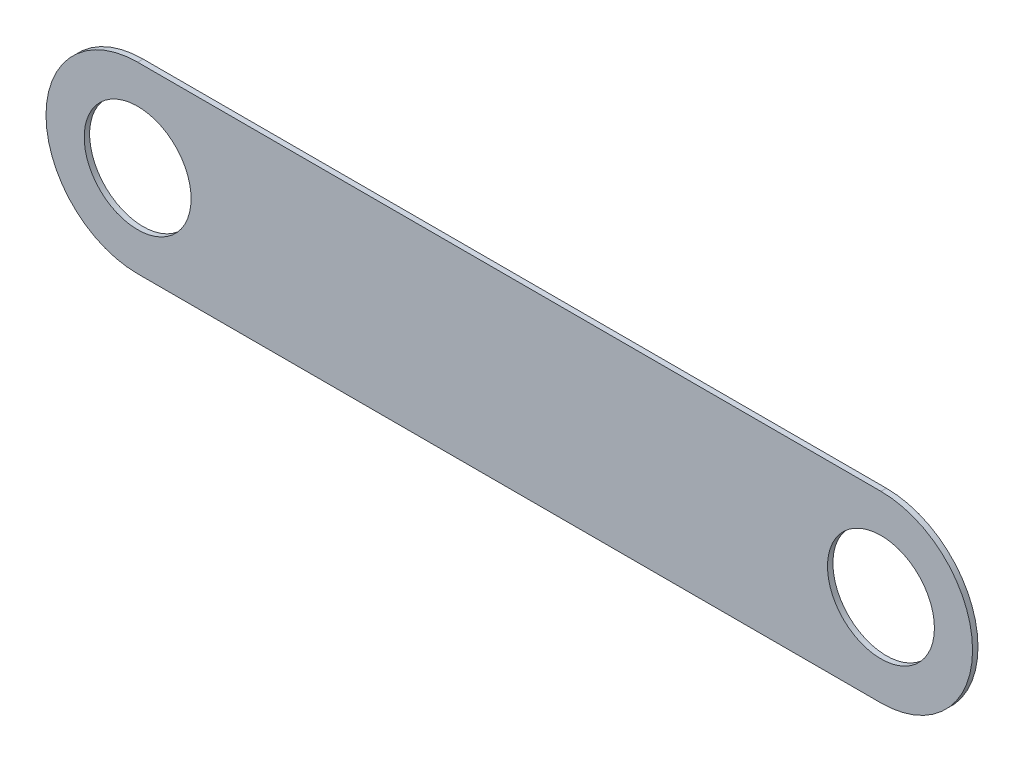
ISO-10303-21;
HEADER;
FILE_DESCRIPTION(('STEP AP214'),'2;1');
FILE_NAME('part.step','',(''),(''),'','','');
FILE_SCHEMA(('AUTOMOTIVE_DESIGN { 1 0 10303 214 1 1 1 1 }'));
ENDSEC;
DATA;
#1=APPLICATION_CONTEXT('core data for automotive mechanical design processes');
#2=APPLICATION_PROTOCOL_DEFINITION('international standard','automotive_design',2000,#1);
#3=PRODUCT_CONTEXT('',#1,'mechanical');
#4=PRODUCT('Part','Part','',(#3));
#5=PRODUCT_RELATED_PRODUCT_CATEGORY('part','',(#4));
#6=PRODUCT_DEFINITION_FORMATION('','',#4);
#7=PRODUCT_DEFINITION_CONTEXT('part definition',#1,'design');
#8=PRODUCT_DEFINITION('design','',#6,#7);
#9=PRODUCT_DEFINITION_SHAPE('','',#8);
#10=(LENGTH_UNIT() NAMED_UNIT(*) SI_UNIT(.MILLI.,.METRE.));
#11=(NAMED_UNIT(*) PLANE_ANGLE_UNIT() SI_UNIT($,.RADIAN.));
#12=(NAMED_UNIT(*) SI_UNIT($,.STERADIAN.) SOLID_ANGLE_UNIT());
#13=UNCERTAINTY_MEASURE_WITH_UNIT(LENGTH_MEASURE(1.E-05),#10,'distance_accuracy_value','');
#14=(GEOMETRIC_REPRESENTATION_CONTEXT(3) GLOBAL_UNCERTAINTY_ASSIGNED_CONTEXT((#13)) GLOBAL_UNIT_ASSIGNED_CONTEXT((#10,
#11,#12)) REPRESENTATION_CONTEXT('',''));
#15=CARTESIAN_POINT('',(0.,0.,0.));
#16=DIRECTION('',(0.,0.,1.));
#17=DIRECTION('',(1.,0.,0.));
#18=AXIS2_PLACEMENT_3D('',#15,#16,#17);
#19=CARTESIAN_POINT('',(110.466632,94.70009,0.));
#20=DIRECTION('',(0.,1.,0.));
#21=DIRECTION('',(1.,0.,0.));
#22=AXIS2_PLACEMENT_3D('',#19,#20,#21);
#23=PLANE('',#22);
#24=DIRECTION('',(1.,0.,0.));
#25=VECTOR('',#24,1.);
#26=CARTESIAN_POINT('',(110.466632,94.70009,0.03556));
#27=LINE('',#26,#25);
#28=CARTESIAN_POINT('',(110.466632,94.70009,0.03556));
#29=VERTEX_POINT('',#28);
#30=CARTESIAN_POINT('',(115.333272,94.70009,0.03556));
#31=VERTEX_POINT('',#30);
#32=EDGE_CURVE('E11',#29,#31,#27,.T.);
#33=ORIENTED_EDGE('',*,*,#32,.F.);
#34=DIRECTION('',(0.,0.,1.));
#35=VECTOR('',#34,1.);
#36=CARTESIAN_POINT('',(110.466632,94.70009,0.));
#37=LINE('',#36,#35);
#38=CARTESIAN_POINT('',(110.466632,94.70009,0.));
#39=VERTEX_POINT('',#38);
#40=EDGE_CURVE('E24',#39,#29,#37,.T.);
#41=ORIENTED_EDGE('',*,*,#40,.F.);
#42=DIRECTION('',(1.,0.,0.));
#43=VECTOR('',#42,1.);
#44=CARTESIAN_POINT('',(110.466632,94.70009,0.));
#45=LINE('',#44,#43);
#46=CARTESIAN_POINT('',(115.333272,94.70009,0.));
#47=VERTEX_POINT('',#46);
#48=EDGE_CURVE('E110',#39,#47,#45,.T.);
#49=ORIENTED_EDGE('',*,*,#48,.T.);
#50=DIRECTION('',(0.,0.,1.));
#51=VECTOR('',#50,1.);
#52=CARTESIAN_POINT('',(115.333272,94.70009,0.));
#53=LINE('',#52,#51);
#54=EDGE_CURVE('E37',#47,#31,#53,.T.);
#55=ORIENTED_EDGE('',*,*,#54,.T.);
#56=EDGE_LOOP('',(#33,#41,#49,#55));
#57=FACE_BOUND('',#56,.T.);
#58=ADVANCED_FACE('F17',(#57),#23,.F.);
#59=CARTESIAN_POINT('',(110.466632,95.3000888,0.));
#60=DIRECTION('',(0.,0.,-1.));
#61=DIRECTION('',(0.,1.,0.));
#62=AXIS2_PLACEMENT_3D('',#59,#60,#61);
#63=CYLINDRICAL_SURFACE('',#62,0.599998799999999);
#64=CARTESIAN_POINT('',(110.466632,95.3000888,0.03556));
#65=DIRECTION('',(0.,0.,1.));
#66=DIRECTION('',(0.,1.,0.));
#67=AXIS2_PLACEMENT_3D('',#64,#65,#66);
#68=CIRCLE('',#67,0.599998799999999);
#69=CARTESIAN_POINT('',(110.466632,95.9000876,0.03556));
#70=VERTEX_POINT('',#69);
#71=EDGE_CURVE('E106',#70,#29,#68,.T.);
#72=ORIENTED_EDGE('',*,*,#71,.F.);
#73=DIRECTION('',(0.,0.,1.));
#74=VECTOR('',#73,1.);
#75=CARTESIAN_POINT('',(110.466632,95.9000876,0.));
#76=LINE('',#75,#74);
#77=CARTESIAN_POINT('',(110.466632,95.9000876,0.));
#78=VERTEX_POINT('',#77);
#79=EDGE_CURVE('E104',#78,#70,#76,.T.);
#80=ORIENTED_EDGE('',*,*,#79,.F.);
#81=CARTESIAN_POINT('',(110.466632,95.3000888,0.));
#82=DIRECTION('',(0.,0.,1.));
#83=DIRECTION('',(0.,1.,0.));
#84=AXIS2_PLACEMENT_3D('',#81,#82,#83);
#85=CIRCLE('',#84,0.599998799999999);
#86=EDGE_CURVE('E102',#78,#39,#85,.T.);
#87=ORIENTED_EDGE('',*,*,#86,.T.);
#88=ORIENTED_EDGE('',*,*,#40,.T.);
#89=EDGE_LOOP('',(#72,#80,#87,#88));
#90=FACE_BOUND('',#89,.T.);
#91=ADVANCED_FACE('F126',(#90),#63,.T.);
#92=CARTESIAN_POINT('',(115.333272,95.3000888,0.));
#93=DIRECTION('',(0.,0.,-1.));
#94=DIRECTION('',(0.,-1.,0.));
#95=AXIS2_PLACEMENT_3D('',#92,#93,#94);
#96=CYLINDRICAL_SURFACE('',#95,0.599998800000004);
#97=CARTESIAN_POINT('',(115.333272,95.3000888,0.03556));
#98=DIRECTION('',(0.,0.,1.));
#99=DIRECTION('',(0.,-1.,0.));
#100=AXIS2_PLACEMENT_3D('',#97,#98,#99);
#101=CIRCLE('',#100,0.599998800000004);
#102=CARTESIAN_POINT('',(115.333272,95.9000876,0.03556));
#103=VERTEX_POINT('',#102);
#104=EDGE_CURVE('E99',#31,#103,#101,.T.);
#105=ORIENTED_EDGE('',*,*,#104,.F.);
#106=ORIENTED_EDGE('',*,*,#54,.F.);
#107=CARTESIAN_POINT('',(115.333272,95.3000888,0.));
#108=DIRECTION('',(0.,0.,1.));
#109=DIRECTION('',(0.,-1.,0.));
#110=AXIS2_PLACEMENT_3D('',#107,#108,#109);
#111=CIRCLE('',#110,0.599998800000004);
#112=CARTESIAN_POINT('',(115.333272,95.9000876,0.));
#113=VERTEX_POINT('',#112);
#114=EDGE_CURVE('E96',#47,#113,#111,.T.);
#115=ORIENTED_EDGE('',*,*,#114,.T.);
#116=DIRECTION('',(0.,0.,1.));
#117=VECTOR('',#116,1.);
#118=CARTESIAN_POINT('',(115.333272,95.9000876,0.));
#119=LINE('',#118,#117);
#120=EDGE_CURVE('E94',#113,#103,#119,.T.);
#121=ORIENTED_EDGE('',*,*,#120,.T.);
#122=EDGE_LOOP('',(#105,#106,#115,#121));
#123=FACE_BOUND('',#122,.T.);
#124=ADVANCED_FACE('F119',(#123),#96,.T.);
#125=CARTESIAN_POINT('',(115.333272,95.9000876,0.));
#126=DIRECTION('',(0.,-1.,0.));
#127=DIRECTION('',(-1.,0.,0.));
#128=AXIS2_PLACEMENT_3D('',#125,#126,#127);
#129=PLANE('',#128);
#130=DIRECTION('',(-1.,0.,0.));
#131=VECTOR('',#130,1.);
#132=CARTESIAN_POINT('',(115.333272,95.9000876,0.03556));
#133=LINE('',#132,#131);
#134=EDGE_CURVE('E91',#103,#70,#133,.T.);
#135=ORIENTED_EDGE('',*,*,#134,.F.);
#136=ORIENTED_EDGE('',*,*,#120,.F.);
#137=DIRECTION('',(-1.,0.,0.));
#138=VECTOR('',#137,1.);
#139=CARTESIAN_POINT('',(115.333272,95.9000876,0.));
#140=LINE('',#139,#138);
#141=EDGE_CURVE('E88',#113,#78,#140,.T.);
#142=ORIENTED_EDGE('',*,*,#141,.T.);
#143=ORIENTED_EDGE('',*,*,#79,.T.);
#144=EDGE_LOOP('',(#135,#136,#142,#143));
#145=FACE_BOUND('',#144,.T.);
#146=ADVANCED_FACE('F125',(#145),#129,.F.);
#147=CARTESIAN_POINT('',(110.466632,95.3000888,0.));
#148=DIRECTION('',(0.,0.,-1.));
#149=DIRECTION('',(1.,0.,0.));
#150=AXIS2_PLACEMENT_3D('',#147,#148,#149);
#151=CYLINDRICAL_SURFACE('',#150,0.3499993);
#152=DIRECTION('',(0.,0.,1.));
#153=VECTOR('',#152,1.);
#154=CARTESIAN_POINT('',(110.8166313,95.3000888,0.));
#155=LINE('',#154,#153);
#156=CARTESIAN_POINT('',(110.8166313,95.3000888,0.));
#157=VERTEX_POINT('',#156);
#158=CARTESIAN_POINT('',(110.8166313,95.3000888,0.03556));
#159=VERTEX_POINT('',#158);
#160=EDGE_CURVE('E86',#157,#159,#155,.T.);
#161=ORIENTED_EDGE('',*,*,#160,.T.);
#162=CARTESIAN_POINT('',(110.466632,95.3000888,0.03556));
#163=DIRECTION('',(0.,0.,1.));
#164=DIRECTION('',(1.,0.,0.));
#165=AXIS2_PLACEMENT_3D('',#162,#163,#164);
#166=CIRCLE('',#165,0.3499993);
#167=EDGE_CURVE('E83',#159,#159,#166,.T.);
#168=ORIENTED_EDGE('',*,*,#167,.T.);
#169=ORIENTED_EDGE('',*,*,#160,.F.);
#170=CARTESIAN_POINT('',(110.466632,95.3000888,0.));
#171=DIRECTION('',(0.,0.,1.));
#172=DIRECTION('',(1.,0.,0.));
#173=AXIS2_PLACEMENT_3D('',#170,#171,#172);
#174=CIRCLE('',#173,0.3499993);
#175=EDGE_CURVE('E74',#157,#157,#174,.T.);
#176=ORIENTED_EDGE('',*,*,#175,.F.);
#177=EDGE_LOOP('',(#161,#168,#169,#176));
#178=FACE_BOUND('',#177,.T.);
#179=ADVANCED_FACE('F137',(#178),#151,.F.);
#180=CARTESIAN_POINT('',(115.3333736,95.2999872,0.));
#181=DIRECTION('',(0.,0.,-1.));
#182=DIRECTION('',(1.,0.,0.));
#183=AXIS2_PLACEMENT_3D('',#180,#181,#182);
#184=CYLINDRICAL_SURFACE('',#183,0.3499993);
#185=DIRECTION('',(0.,0.,1.));
#186=VECTOR('',#185,1.);
#187=CARTESIAN_POINT('',(115.6833729,95.2999872,0.));
#188=LINE('',#187,#186);
#189=CARTESIAN_POINT('',(115.6833729,95.2999872,0.));
#190=VERTEX_POINT('',#189);
#191=CARTESIAN_POINT('',(115.6833729,95.2999872,0.03556));
#192=VERTEX_POINT('',#191);
#193=EDGE_CURVE('E68',#190,#192,#188,.T.);
#194=ORIENTED_EDGE('',*,*,#193,.T.);
#195=CARTESIAN_POINT('',(115.3333736,95.2999872,0.03556));
#196=DIRECTION('',(0.,0.,1.));
#197=DIRECTION('',(1.,0.,0.));
#198=AXIS2_PLACEMENT_3D('',#195,#196,#197);
#199=CIRCLE('',#198,0.3499993);
#200=EDGE_CURVE('E73',#192,#192,#199,.T.);
#201=ORIENTED_EDGE('',*,*,#200,.T.);
#202=ORIENTED_EDGE('',*,*,#193,.F.);
#203=CARTESIAN_POINT('',(115.3333736,95.2999872,0.));
#204=DIRECTION('',(0.,0.,1.));
#205=DIRECTION('',(1.,0.,0.));
#206=AXIS2_PLACEMENT_3D('',#203,#204,#205);
#207=CIRCLE('',#206,0.3499993);
#208=EDGE_CURVE('E71',#190,#190,#207,.T.);
#209=ORIENTED_EDGE('',*,*,#208,.F.);
#210=EDGE_LOOP('',(#194,#201,#202,#209));
#211=FACE_BOUND('',#210,.T.);
#212=ADVANCED_FACE('F70',(#211),#184,.F.);
#213=CARTESIAN_POINT('',(110.466632,94.70009,0.));
#214=DIRECTION('',(0.,0.,-1.));
#215=DIRECTION('',(-1.,0.,0.));
#216=AXIS2_PLACEMENT_3D('',#213,#214,#215);
#217=PLANE('',#216);
#218=ORIENTED_EDGE('',*,*,#48,.F.);
#219=ORIENTED_EDGE('',*,*,#86,.F.);
#220=ORIENTED_EDGE('',*,*,#141,.F.);
#221=ORIENTED_EDGE('',*,*,#114,.F.);
#222=EDGE_LOOP('',(#218,#219,#220,#221));
#223=FACE_BOUND('',#222,.T.);
#224=ORIENTED_EDGE('',*,*,#175,.T.);
#225=EDGE_LOOP('',(#224));
#226=FACE_BOUND('',#225,.T.);
#227=ORIENTED_EDGE('',*,*,#208,.T.);
#228=EDGE_LOOP('',(#227));
#229=FACE_BOUND('',#228,.T.);
#230=ADVANCED_FACE('F77',(#223,#226,#229),#217,.T.);
#231=CARTESIAN_POINT('',(110.466632,94.70009,0.03556));
#232=DIRECTION('',(0.,0.,-1.));
#233=DIRECTION('',(-1.,0.,0.));
#234=AXIS2_PLACEMENT_3D('',#231,#232,#233);
#235=PLANE('',#234);
#236=ORIENTED_EDGE('',*,*,#134,.T.);
#237=ORIENTED_EDGE('',*,*,#71,.T.);
#238=ORIENTED_EDGE('',*,*,#32,.T.);
#239=ORIENTED_EDGE('',*,*,#104,.T.);
#240=EDGE_LOOP('',(#236,#237,#238,#239));
#241=FACE_BOUND('',#240,.T.);
#242=ORIENTED_EDGE('',*,*,#167,.F.);
#243=EDGE_LOOP('',(#242));
#244=FACE_BOUND('',#243,.T.);
#245=ORIENTED_EDGE('',*,*,#200,.F.);
#246=EDGE_LOOP('',(#245));
#247=FACE_BOUND('',#246,.T.);
#248=ADVANCED_FACE('F122',(#241,#244,#247),#235,.F.);
#249=CLOSED_SHELL('',(#58,#91,#124,#146,#179,#212,#230,#248));
#250=MANIFOLD_SOLID_BREP('B1',#249);
#251=ADVANCED_BREP_SHAPE_REPRESENTATION('',(#18,#250),#14);
#252=SHAPE_DEFINITION_REPRESENTATION(#9,#251);
ENDSEC;
END-ISO-10303-21;
